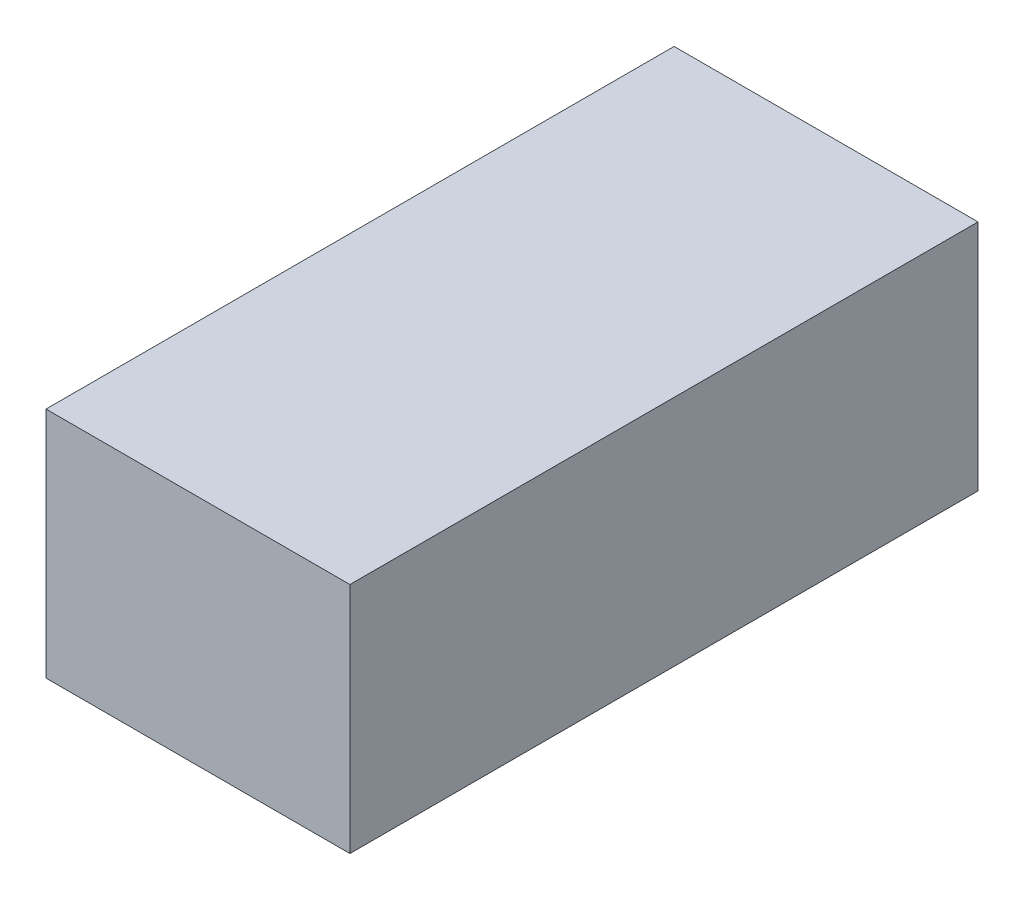
ISO-10303-21;
HEADER;
FILE_DESCRIPTION(('STEP AP214'),'2;1');
FILE_NAME('part.step','',(''),(''),'','','');
FILE_SCHEMA(('AUTOMOTIVE_DESIGN { 1 0 10303 214 1 1 1 1 }'));
ENDSEC;
DATA;
#1=APPLICATION_CONTEXT('core data for automotive mechanical design processes');
#2=APPLICATION_PROTOCOL_DEFINITION('international standard','automotive_design',2000,#1);
#3=PRODUCT_CONTEXT('',#1,'mechanical');
#4=PRODUCT('Part','Part','',(#3));
#5=PRODUCT_RELATED_PRODUCT_CATEGORY('part','',(#4));
#6=PRODUCT_DEFINITION_FORMATION('','',#4);
#7=PRODUCT_DEFINITION_CONTEXT('part definition',#1,'design');
#8=PRODUCT_DEFINITION('design','',#6,#7);
#9=PRODUCT_DEFINITION_SHAPE('','',#8);
#10=(LENGTH_UNIT() NAMED_UNIT(*) SI_UNIT(.MILLI.,.METRE.));
#11=(NAMED_UNIT(*) PLANE_ANGLE_UNIT() SI_UNIT($,.RADIAN.));
#12=(NAMED_UNIT(*) SI_UNIT($,.STERADIAN.) SOLID_ANGLE_UNIT());
#13=UNCERTAINTY_MEASURE_WITH_UNIT(LENGTH_MEASURE(1.E-05),#10,'distance_accuracy_value','');
#14=(GEOMETRIC_REPRESENTATION_CONTEXT(3) GLOBAL_UNCERTAINTY_ASSIGNED_CONTEXT((#13)) GLOBAL_UNIT_ASSIGNED_CONTEXT((#10,
#11,#12)) REPRESENTATION_CONTEXT('',''));
#15=CARTESIAN_POINT('',(0.,0.,0.));
#16=DIRECTION('',(0.,0.,1.));
#17=DIRECTION('',(1.,0.,0.));
#18=AXIS2_PLACEMENT_3D('',#15,#16,#17);
#19=CARTESIAN_POINT('',(-15.,11.5,31.));
#20=DIRECTION('',(0.,-1.,0.));
#21=DIRECTION('',(0.,0.,-1.));
#22=AXIS2_PLACEMENT_3D('',#19,#20,#21);
#23=PLANE('',#22);
#24=DIRECTION('',(-1.,0.,0.));
#25=VECTOR('',#24,1.);
#26=CARTESIAN_POINT('',(-15.,11.5,-31.));
#27=LINE('',#26,#25);
#28=CARTESIAN_POINT('',(15.,11.5,-31.));
#29=VERTEX_POINT('',#28);
#30=CARTESIAN_POINT('',(-15.,11.5,-31.));
#31=VERTEX_POINT('',#30);
#32=EDGE_CURVE('E97',#29,#31,#27,.T.);
#33=ORIENTED_EDGE('',*,*,#32,.T.);
#34=DIRECTION('',(0.,0.,-1.));
#35=VECTOR('',#34,1.);
#36=CARTESIAN_POINT('',(-15.,11.5,31.));
#37=LINE('',#36,#35);
#38=CARTESIAN_POINT('',(-15.,11.5,31.));
#39=VERTEX_POINT('',#38);
#40=EDGE_CURVE('E11',#39,#31,#37,.T.);
#41=ORIENTED_EDGE('',*,*,#40,.F.);
#42=DIRECTION('',(-1.,0.,0.));
#43=VECTOR('',#42,1.);
#44=CARTESIAN_POINT('',(-15.,11.5,31.));
#45=LINE('',#44,#43);
#46=CARTESIAN_POINT('',(15.,11.5,31.));
#47=VERTEX_POINT('',#46);
#48=EDGE_CURVE('E85',#47,#39,#45,.T.);
#49=ORIENTED_EDGE('',*,*,#48,.F.);
#50=DIRECTION('',(0.,0.,-1.));
#51=VECTOR('',#50,1.);
#52=CARTESIAN_POINT('',(15.,11.5,31.));
#53=LINE('',#52,#51);
#54=EDGE_CURVE('E93',#47,#29,#53,.T.);
#55=ORIENTED_EDGE('',*,*,#54,.T.);
#56=EDGE_LOOP('',(#33,#41,#49,#55));
#57=FACE_BOUND('',#56,.T.);
#58=ADVANCED_FACE('F34',(#57),#23,.F.);
#59=CARTESIAN_POINT('',(-15.,-11.5,31.));
#60=DIRECTION('',(1.,0.,0.));
#61=DIRECTION('',(0.,0.,-1.));
#62=AXIS2_PLACEMENT_3D('',#59,#60,#61);
#63=PLANE('',#62);
#64=DIRECTION('',(0.,-1.,0.));
#65=VECTOR('',#64,1.);
#66=CARTESIAN_POINT('',(-15.,-11.5,-31.));
#67=LINE('',#66,#65);
#68=CARTESIAN_POINT('',(-15.,-11.5,-31.));
#69=VERTEX_POINT('',#68);
#70=EDGE_CURVE('E89',#31,#69,#67,.T.);
#71=ORIENTED_EDGE('',*,*,#70,.T.);
#72=DIRECTION('',(0.,0.,-1.));
#73=VECTOR('',#72,1.);
#74=CARTESIAN_POINT('',(-15.,-11.5,31.));
#75=LINE('',#74,#73);
#76=CARTESIAN_POINT('',(-15.,-11.5,31.));
#77=VERTEX_POINT('',#76);
#78=EDGE_CURVE('E42',#77,#69,#75,.T.);
#79=ORIENTED_EDGE('',*,*,#78,.F.);
#80=DIRECTION('',(0.,-1.,0.));
#81=VECTOR('',#80,1.);
#82=CARTESIAN_POINT('',(-15.,-11.5,31.));
#83=LINE('',#82,#81);
#84=EDGE_CURVE('E80',#39,#77,#83,.T.);
#85=ORIENTED_EDGE('',*,*,#84,.F.);
#86=ORIENTED_EDGE('',*,*,#40,.T.);
#87=EDGE_LOOP('',(#71,#79,#85,#86));
#88=FACE_BOUND('',#87,.T.);
#89=ADVANCED_FACE('F88',(#88),#63,.F.);
#90=CARTESIAN_POINT('',(-15.,-11.5,31.));
#91=DIRECTION('',(0.,1.,0.));
#92=DIRECTION('',(0.,0.,1.));
#93=AXIS2_PLACEMENT_3D('',#90,#91,#92);
#94=PLANE('',#93);
#95=DIRECTION('',(1.,0.,0.));
#96=VECTOR('',#95,1.);
#97=CARTESIAN_POINT('',(-15.,-11.5,-31.));
#98=LINE('',#97,#96);
#99=CARTESIAN_POINT('',(15.,-11.5,-31.));
#100=VERTEX_POINT('',#99);
#101=EDGE_CURVE('E67',#69,#100,#98,.T.);
#102=ORIENTED_EDGE('',*,*,#101,.T.);
#103=DIRECTION('',(0.,0.,-1.));
#104=VECTOR('',#103,1.);
#105=CARTESIAN_POINT('',(15.,-11.5,31.));
#106=LINE('',#105,#104);
#107=CARTESIAN_POINT('',(15.,-11.5,31.));
#108=VERTEX_POINT('',#107);
#109=EDGE_CURVE('E90',#108,#100,#106,.T.);
#110=ORIENTED_EDGE('',*,*,#109,.F.);
#111=DIRECTION('',(1.,0.,0.));
#112=VECTOR('',#111,1.);
#113=CARTESIAN_POINT('',(-15.,-11.5,31.));
#114=LINE('',#113,#112);
#115=EDGE_CURVE('E83',#77,#108,#114,.T.);
#116=ORIENTED_EDGE('',*,*,#115,.F.);
#117=ORIENTED_EDGE('',*,*,#78,.T.);
#118=EDGE_LOOP('',(#102,#110,#116,#117));
#119=FACE_BOUND('',#118,.T.);
#120=ADVANCED_FACE('F91',(#119),#94,.F.);
#121=CARTESIAN_POINT('',(15.,-11.5,31.));
#122=DIRECTION('',(-1.,0.,0.));
#123=DIRECTION('',(0.,0.,1.));
#124=AXIS2_PLACEMENT_3D('',#121,#122,#123);
#125=PLANE('',#124);
#126=DIRECTION('',(0.,1.,0.));
#127=VECTOR('',#126,1.);
#128=CARTESIAN_POINT('',(15.,-11.5,-31.));
#129=LINE('',#128,#127);
#130=EDGE_CURVE('E73',#100,#29,#129,.T.);
#131=ORIENTED_EDGE('',*,*,#130,.T.);
#132=ORIENTED_EDGE('',*,*,#54,.F.);
#133=DIRECTION('',(0.,1.,0.));
#134=VECTOR('',#133,1.);
#135=CARTESIAN_POINT('',(15.,-11.5,31.));
#136=LINE('',#135,#134);
#137=EDGE_CURVE('E50',#108,#47,#136,.T.);
#138=ORIENTED_EDGE('',*,*,#137,.F.);
#139=ORIENTED_EDGE('',*,*,#109,.T.);
#140=EDGE_LOOP('',(#131,#132,#138,#139));
#141=FACE_BOUND('',#140,.T.);
#142=ADVANCED_FACE('F104',(#141),#125,.F.);
#143=CARTESIAN_POINT('',(0.,0.,31.));
#144=DIRECTION('',(0.,0.,1.));
#145=DIRECTION('',(1.,0.,0.));
#146=AXIS2_PLACEMENT_3D('',#143,#144,#145);
#147=PLANE('',#146);
#148=ORIENTED_EDGE('',*,*,#48,.T.);
#149=ORIENTED_EDGE('',*,*,#84,.T.);
#150=ORIENTED_EDGE('',*,*,#115,.T.);
#151=ORIENTED_EDGE('',*,*,#137,.T.);
#152=EDGE_LOOP('',(#148,#149,#150,#151));
#153=FACE_BOUND('',#152,.T.);
#154=ADVANCED_FACE('F81',(#153),#147,.T.);
#155=CARTESIAN_POINT('',(0.,0.,-31.));
#156=DIRECTION('',(0.,0.,1.));
#157=DIRECTION('',(1.,0.,0.));
#158=AXIS2_PLACEMENT_3D('',#155,#156,#157);
#159=PLANE('',#158);
#160=ORIENTED_EDGE('',*,*,#32,.F.);
#161=ORIENTED_EDGE('',*,*,#130,.F.);
#162=ORIENTED_EDGE('',*,*,#101,.F.);
#163=ORIENTED_EDGE('',*,*,#70,.F.);
#164=EDGE_LOOP('',(#160,#161,#162,#163));
#165=FACE_BOUND('',#164,.T.);
#166=ADVANCED_FACE('F107',(#165),#159,.F.);
#167=CLOSED_SHELL('',(#58,#89,#120,#142,#154,#166));
#168=MANIFOLD_SOLID_BREP('B2',#167);
#169=ADVANCED_BREP_SHAPE_REPRESENTATION('',(#18,#168),#14);
#170=SHAPE_DEFINITION_REPRESENTATION(#9,#169);
ENDSEC;
END-ISO-10303-21;
